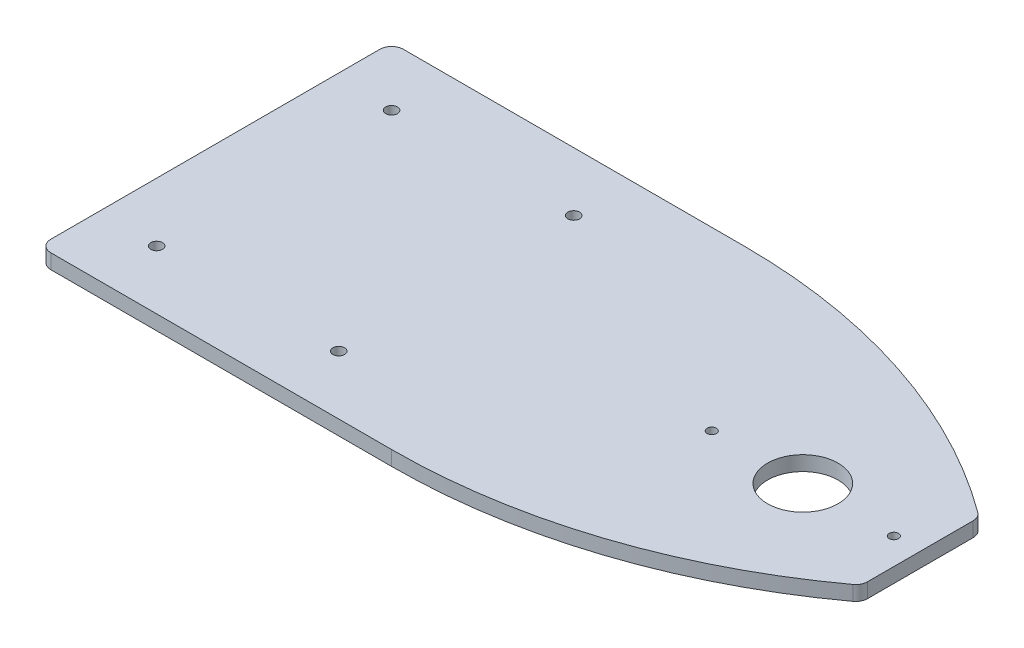
ISO-10303-21;
HEADER;
FILE_DESCRIPTION(('STEP AP214'),'2;1');
FILE_NAME('part.step','',(''),(''),'','','');
FILE_SCHEMA(('AUTOMOTIVE_DESIGN { 1 0 10303 214 1 1 1 1 }'));
ENDSEC;
DATA;
#1=APPLICATION_CONTEXT('core data for automotive mechanical design processes');
#2=APPLICATION_PROTOCOL_DEFINITION('international standard','automotive_design',2000,#1);
#3=PRODUCT_CONTEXT('',#1,'mechanical');
#4=PRODUCT('Part','Part','',(#3));
#5=PRODUCT_RELATED_PRODUCT_CATEGORY('part','',(#4));
#6=PRODUCT_DEFINITION_FORMATION('','',#4);
#7=PRODUCT_DEFINITION_CONTEXT('part definition',#1,'design');
#8=PRODUCT_DEFINITION('design','',#6,#7);
#9=PRODUCT_DEFINITION_SHAPE('','',#8);
#10=(LENGTH_UNIT() NAMED_UNIT(*) SI_UNIT(.MILLI.,.METRE.));
#11=(NAMED_UNIT(*) PLANE_ANGLE_UNIT() SI_UNIT($,.RADIAN.));
#12=(NAMED_UNIT(*) SI_UNIT($,.STERADIAN.) SOLID_ANGLE_UNIT());
#13=UNCERTAINTY_MEASURE_WITH_UNIT(LENGTH_MEASURE(1.E-05),#10,'distance_accuracy_value','');
#14=(GEOMETRIC_REPRESENTATION_CONTEXT(3) GLOBAL_UNCERTAINTY_ASSIGNED_CONTEXT((#13)) GLOBAL_UNIT_ASSIGNED_CONTEXT((#10,
#11,#12)) REPRESENTATION_CONTEXT('',''));
#15=CARTESIAN_POINT('',(0.,0.,0.));
#16=DIRECTION('',(0.,0.,1.));
#17=DIRECTION('',(1.,0.,0.));
#18=AXIS2_PLACEMENT_3D('',#15,#16,#17);
#19=CARTESIAN_POINT('',(76.2,3.175,38.1));
#20=DIRECTION('',(-1.,0.,0.));
#21=DIRECTION('',(0.,0.,1.));
#22=AXIS2_PLACEMENT_3D('',#19,#20,#21);
#23=PLANE('',#22);
#24=DIRECTION('',(0.,0.,-1.));
#25=VECTOR('',#24,1.);
#26=CARTESIAN_POINT('',(76.2,3.175,38.1));
#27=LINE('',#26,#25);
#28=CARTESIAN_POINT('',(76.2,3.175,11.421961703308));
#29=VERTEX_POINT('',#28);
#30=CARTESIAN_POINT('',(76.2,3.175,-11.421961703308));
#31=VERTEX_POINT('',#30);
#32=EDGE_CURVE('E195',#29,#31,#27,.T.);
#33=ORIENTED_EDGE('',*,*,#32,.F.);
#34=DIRECTION('',(0.,1.,0.));
#35=VECTOR('',#34,1.);
#36=CARTESIAN_POINT('',(76.2,3.175,11.421961703308));
#37=LINE('',#36,#35);
#38=CARTESIAN_POINT('',(76.2,0.,11.421961703308));
#39=VERTEX_POINT('',#38);
#40=EDGE_CURVE('E163',#29,#39,#37,.F.);
#41=ORIENTED_EDGE('',*,*,#40,.T.);
#42=DIRECTION('',(0.,0.,-1.));
#43=VECTOR('',#42,1.);
#44=CARTESIAN_POINT('',(76.2,0.,38.1));
#45=LINE('',#44,#43);
#46=CARTESIAN_POINT('',(76.2,0.,-11.421961703308));
#47=VERTEX_POINT('',#46);
#48=EDGE_CURVE('E145',#39,#47,#45,.T.);
#49=ORIENTED_EDGE('',*,*,#48,.T.);
#50=DIRECTION('',(0.,1.,0.));
#51=VECTOR('',#50,1.);
#52=CARTESIAN_POINT('',(76.2,3.175,-11.421961703308));
#53=LINE('',#52,#51);
#54=EDGE_CURVE('E160',#47,#31,#53,.T.);
#55=ORIENTED_EDGE('',*,*,#54,.T.);
#56=EDGE_LOOP('',(#33,#41,#49,#55));
#57=FACE_BOUND('',#56,.T.);
#58=ADVANCED_FACE('F41',(#57),#23,.F.);
#59=CARTESIAN_POINT('',(76.2,3.175,-38.1));
#60=DIRECTION('',(0.,0.,1.));
#61=DIRECTION('',(1.,0.,0.));
#62=AXIS2_PLACEMENT_3D('',#59,#60,#61);
#63=PLANE('',#62);
#64=DIRECTION('',(-1.,0.,0.));
#65=VECTOR('',#64,1.);
#66=CARTESIAN_POINT('',(76.2,0.,-38.1));
#67=LINE('',#66,#65);
#68=CARTESIAN_POINT('',(0.,0.,-38.1));
#69=VERTEX_POINT('',#68);
#70=CARTESIAN_POINT('',(-73.6599999999999,0.,-38.1));
#71=VERTEX_POINT('',#70);
#72=EDGE_CURVE('E134',#69,#71,#67,.T.);
#73=ORIENTED_EDGE('',*,*,#72,.T.);
#74=DIRECTION('',(0.,-1.,0.));
#75=VECTOR('',#74,1.);
#76=CARTESIAN_POINT('',(-73.66,3.175,-38.1));
#77=LINE('',#76,#75);
#78=CARTESIAN_POINT('',(-73.6599999999999,3.175,-38.1));
#79=VERTEX_POINT('',#78);
#80=EDGE_CURVE('E11',#71,#79,#77,.F.);
#81=ORIENTED_EDGE('',*,*,#80,.T.);
#82=DIRECTION('',(-1.,0.,0.));
#83=VECTOR('',#82,1.);
#84=CARTESIAN_POINT('',(76.2,3.175,-38.1));
#85=LINE('',#84,#83);
#86=CARTESIAN_POINT('',(0.,3.175,-38.1));
#87=VERTEX_POINT('',#86);
#88=EDGE_CURVE('E133',#87,#79,#85,.T.);
#89=ORIENTED_EDGE('',*,*,#88,.F.);
#90=DIRECTION('',(0.,1.,0.));
#91=VECTOR('',#90,1.);
#92=CARTESIAN_POINT('',(0.,0.,-38.1));
#93=LINE('',#92,#91);
#94=EDGE_CURVE('E124',#69,#87,#93,.T.);
#95=ORIENTED_EDGE('',*,*,#94,.F.);
#96=EDGE_LOOP('',(#73,#81,#89,#95));
#97=FACE_BOUND('',#96,.T.);
#98=ADVANCED_FACE('F132',(#97),#63,.F.);
#99=CARTESIAN_POINT('',(0.,3.175,0.));
#100=DIRECTION('',(0.,1.,0.));
#101=DIRECTION('',(0.,0.,1.));
#102=AXIS2_PLACEMENT_3D('',#99,#100,#101);
#103=PLANE('',#102);
#104=CARTESIAN_POINT('',(31.115,3.175,0.));
#105=DIRECTION('',(0.,1.,0.));
#106=DIRECTION('',(0.,0.,1.));
#107=AXIS2_PLACEMENT_3D('',#104,#105,#106);
#108=CIRCLE('',#107,1.0033);
#109=CARTESIAN_POINT('',(31.115,3.175,1.0033));
#110=VERTEX_POINT('',#109);
#111=EDGE_CURVE('E246',#110,#110,#108,.T.);
#112=ORIENTED_EDGE('',*,*,#111,.F.);
#113=EDGE_LOOP('',(#112));
#114=FACE_BOUND('',#113,.T.);
#115=CARTESIAN_POINT('',(70.485,3.175,0.));
#116=DIRECTION('',(0.,1.,0.));
#117=DIRECTION('',(0.,0.,1.));
#118=AXIS2_PLACEMENT_3D('',#115,#116,#117);
#119=CIRCLE('',#118,1.0033);
#120=CARTESIAN_POINT('',(70.485,3.175,1.0033));
#121=VERTEX_POINT('',#120);
#122=EDGE_CURVE('E243',#121,#121,#119,.T.);
#123=ORIENTED_EDGE('',*,*,#122,.F.);
#124=EDGE_LOOP('',(#123));
#125=FACE_BOUND('',#124,.T.);
#126=CARTESIAN_POINT('',(-63.5,3.175,25.4));
#127=DIRECTION('',(0.,1.,0.));
#128=DIRECTION('',(0.,0.,1.));
#129=AXIS2_PLACEMENT_3D('',#126,#127,#128);
#130=CIRCLE('',#129,1.27);
#131=CARTESIAN_POINT('',(-63.5,3.175,26.67));
#132=VERTEX_POINT('',#131);
#133=EDGE_CURVE('E218',#132,#132,#130,.T.);
#134=ORIENTED_EDGE('',*,*,#133,.F.);
#135=EDGE_LOOP('',(#134));
#136=FACE_BOUND('',#135,.T.);
#137=CARTESIAN_POINT('',(-24.13,3.175,-25.4));
#138=DIRECTION('',(0.,1.,0.));
#139=DIRECTION('',(0.,0.,1.));
#140=AXIS2_PLACEMENT_3D('',#137,#138,#139);
#141=CIRCLE('',#140,1.27);
#142=CARTESIAN_POINT('',(-24.13,3.175,-24.13));
#143=VERTEX_POINT('',#142);
#144=EDGE_CURVE('E223',#143,#143,#141,.T.);
#145=ORIENTED_EDGE('',*,*,#144,.F.);
#146=EDGE_LOOP('',(#145));
#147=FACE_BOUND('',#146,.T.);
#148=CARTESIAN_POINT('',(-24.13,3.175,25.4));
#149=DIRECTION('',(0.,1.,0.));
#150=DIRECTION('',(0.,0.,1.));
#151=AXIS2_PLACEMENT_3D('',#148,#149,#150);
#152=CIRCLE('',#151,1.27);
#153=CARTESIAN_POINT('',(-24.13,3.175,26.67));
#154=VERTEX_POINT('',#153);
#155=EDGE_CURVE('E228',#154,#154,#152,.T.);
#156=ORIENTED_EDGE('',*,*,#155,.F.);
#157=EDGE_LOOP('',(#156));
#158=FACE_BOUND('',#157,.T.);
#159=CARTESIAN_POINT('',(-63.5,3.175,-25.4));
#160=DIRECTION('',(0.,1.,0.));
#161=DIRECTION('',(0.,0.,1.));
#162=AXIS2_PLACEMENT_3D('',#159,#160,#161);
#163=CIRCLE('',#162,1.27);
#164=CARTESIAN_POINT('',(-63.5,3.175,-24.13));
#165=VERTEX_POINT('',#164);
#166=EDGE_CURVE('E216',#165,#165,#163,.T.);
#167=ORIENTED_EDGE('',*,*,#166,.F.);
#168=EDGE_LOOP('',(#167));
#169=FACE_BOUND('',#168,.T.);
#170=CARTESIAN_POINT('',(50.8,3.175,0.));
#171=DIRECTION('',(0.,1.,0.));
#172=DIRECTION('',(0.,0.,1.));
#173=AXIS2_PLACEMENT_3D('',#170,#171,#172);
#174=CIRCLE('',#173,7.62);
#175=CARTESIAN_POINT('',(50.8,3.175,7.62));
#176=VERTEX_POINT('',#175);
#177=EDGE_CURVE('E208',#176,#176,#174,.T.);
#178=ORIENTED_EDGE('',*,*,#177,.F.);
#179=EDGE_LOOP('',(#178));
#180=FACE_BOUND('',#179,.T.);
#181=DIRECTION('',(0.,0.,1.));
#182=VECTOR('',#181,1.);
#183=CARTESIAN_POINT('',(-76.2,3.175,38.1));
#184=LINE('',#183,#182);
#185=CARTESIAN_POINT('',(-76.2,3.175,-35.56));
#186=VERTEX_POINT('',#185);
#187=CARTESIAN_POINT('',(-76.2,3.175,35.56));
#188=VERTEX_POINT('',#187);
#189=EDGE_CURVE('E142',#186,#188,#184,.T.);
#190=ORIENTED_EDGE('',*,*,#189,.T.);
#191=CARTESIAN_POINT('',(-73.66,3.175,35.56));
#192=DIRECTION('',(0.,1.,0.));
#193=DIRECTION('',(0.,0.,1.));
#194=AXIS2_PLACEMENT_3D('',#191,#192,#193);
#195=CIRCLE('',#194,2.54);
#196=CARTESIAN_POINT('',(-73.6599999999999,3.175,38.1));
#197=VERTEX_POINT('',#196);
#198=EDGE_CURVE('E47',#188,#197,#195,.T.);
#199=ORIENTED_EDGE('',*,*,#198,.T.);
#200=DIRECTION('',(1.,0.,0.));
#201=VECTOR('',#200,1.);
#202=CARTESIAN_POINT('',(76.2,3.175,38.1));
#203=LINE('',#202,#201);
#204=CARTESIAN_POINT('',(0.,3.175,38.1));
#205=VERTEX_POINT('',#204);
#206=EDGE_CURVE('E144',#197,#205,#203,.T.);
#207=ORIENTED_EDGE('',*,*,#206,.T.);
#208=CARTESIAN_POINT('',(0.,3.175,-88.9));
#209=DIRECTION('',(0.,-1.,0.));
#210=DIRECTION('',(0.,0.,1.));
#211=AXIS2_PLACEMENT_3D('',#208,#209,#210);
#212=CIRCLE('',#211,127.);
#213=CARTESIAN_POINT('',(75.1632653061225,3.175,13.4693486768449));
#214=VERTEX_POINT('',#213);
#215=EDGE_CURVE('E203',#214,#205,#212,.T.);
#216=ORIENTED_EDGE('',*,*,#215,.F.);
#217=CARTESIAN_POINT('',(73.66,3.175,11.421961703308));
#218=DIRECTION('',(0.,1.,0.));
#219=DIRECTION('',(0.,0.,1.));
#220=AXIS2_PLACEMENT_3D('',#217,#218,#219);
#221=CIRCLE('',#220,2.54);
#222=EDGE_CURVE('E157',#214,#29,#221,.T.);
#223=ORIENTED_EDGE('',*,*,#222,.T.);
#224=ORIENTED_EDGE('',*,*,#32,.T.);
#225=CARTESIAN_POINT('',(73.66,3.175,-11.421961703308));
#226=DIRECTION('',(0.,1.,0.));
#227=DIRECTION('',(0.,0.,1.));
#228=AXIS2_PLACEMENT_3D('',#225,#226,#227);
#229=CIRCLE('',#228,2.54);
#230=CARTESIAN_POINT('',(75.1632653061225,3.175,-13.469348676845));
#231=VERTEX_POINT('',#230);
#232=EDGE_CURVE('E153',#31,#231,#229,.T.);
#233=ORIENTED_EDGE('',*,*,#232,.T.);
#234=CARTESIAN_POINT('',(0.,3.175,88.9));
#235=DIRECTION('',(0.,-1.,0.));
#236=DIRECTION('',(0.,0.,-1.));
#237=AXIS2_PLACEMENT_3D('',#234,#235,#236);
#238=CIRCLE('',#237,127.);
#239=EDGE_CURVE('E128',#87,#231,#238,.T.);
#240=ORIENTED_EDGE('',*,*,#239,.F.);
#241=ORIENTED_EDGE('',*,*,#88,.T.);
#242=CARTESIAN_POINT('',(-73.66,3.175,-35.56));
#243=DIRECTION('',(0.,1.,0.));
#244=DIRECTION('',(0.,0.,1.));
#245=AXIS2_PLACEMENT_3D('',#242,#243,#244);
#246=CIRCLE('',#245,2.54);
#247=EDGE_CURVE('E178',#79,#186,#246,.T.);
#248=ORIENTED_EDGE('',*,*,#247,.T.);
#249=EDGE_LOOP('',(#190,#199,#207,#216,#223,#224,#233,#240,#241,#248));
#250=FACE_BOUND('',#249,.T.);
#251=ADVANCED_FACE('F185',(#114,#125,#136,#147,#158,#169,#180,#250),#103,.T.);
#252=CARTESIAN_POINT('',(0.,0.,0.));
#253=DIRECTION('',(0.,1.,0.));
#254=DIRECTION('',(0.,0.,1.));
#255=AXIS2_PLACEMENT_3D('',#252,#253,#254);
#256=PLANE('',#255);
#257=CARTESIAN_POINT('',(31.115,0.,0.));
#258=DIRECTION('',(0.,1.,0.));
#259=DIRECTION('',(0.,0.,1.));
#260=AXIS2_PLACEMENT_3D('',#257,#258,#259);
#261=CIRCLE('',#260,1.0033);
#262=CARTESIAN_POINT('',(31.115,0.,1.0033));
#263=VERTEX_POINT('',#262);
#264=EDGE_CURVE('E240',#263,#263,#261,.T.);
#265=ORIENTED_EDGE('',*,*,#264,.T.);
#266=EDGE_LOOP('',(#265));
#267=FACE_BOUND('',#266,.T.);
#268=CARTESIAN_POINT('',(70.485,0.,0.));
#269=DIRECTION('',(0.,1.,0.));
#270=DIRECTION('',(0.,0.,1.));
#271=AXIS2_PLACEMENT_3D('',#268,#269,#270);
#272=CIRCLE('',#271,1.0033);
#273=CARTESIAN_POINT('',(70.485,0.,1.0033));
#274=VERTEX_POINT('',#273);
#275=EDGE_CURVE('E239',#274,#274,#272,.T.);
#276=ORIENTED_EDGE('',*,*,#275,.T.);
#277=EDGE_LOOP('',(#276));
#278=FACE_BOUND('',#277,.T.);
#279=CARTESIAN_POINT('',(-63.5,0.,25.4));
#280=DIRECTION('',(0.,1.,0.));
#281=DIRECTION('',(0.,0.,1.));
#282=AXIS2_PLACEMENT_3D('',#279,#280,#281);
#283=CIRCLE('',#282,1.27);
#284=CARTESIAN_POINT('',(-63.5,0.,26.67));
#285=VERTEX_POINT('',#284);
#286=EDGE_CURVE('E230',#285,#285,#283,.T.);
#287=ORIENTED_EDGE('',*,*,#286,.T.);
#288=EDGE_LOOP('',(#287));
#289=FACE_BOUND('',#288,.T.);
#290=CARTESIAN_POINT('',(-24.13,0.,-25.4));
#291=DIRECTION('',(0.,1.,0.));
#292=DIRECTION('',(0.,0.,1.));
#293=AXIS2_PLACEMENT_3D('',#290,#291,#292);
#294=CIRCLE('',#293,1.27);
#295=CARTESIAN_POINT('',(-24.13,0.,-24.13));
#296=VERTEX_POINT('',#295);
#297=EDGE_CURVE('E224',#296,#296,#294,.T.);
#298=ORIENTED_EDGE('',*,*,#297,.T.);
#299=EDGE_LOOP('',(#298));
#300=FACE_BOUND('',#299,.T.);
#301=CARTESIAN_POINT('',(-24.13,0.,25.4));
#302=DIRECTION('',(0.,1.,0.));
#303=DIRECTION('',(0.,0.,1.));
#304=AXIS2_PLACEMENT_3D('',#301,#302,#303);
#305=CIRCLE('',#304,1.27);
#306=CARTESIAN_POINT('',(-24.13,0.,26.67));
#307=VERTEX_POINT('',#306);
#308=EDGE_CURVE('E234',#307,#307,#305,.T.);
#309=ORIENTED_EDGE('',*,*,#308,.T.);
#310=EDGE_LOOP('',(#309));
#311=FACE_BOUND('',#310,.T.);
#312=CARTESIAN_POINT('',(-63.5,0.,-25.4));
#313=DIRECTION('',(0.,1.,0.));
#314=DIRECTION('',(0.,0.,1.));
#315=AXIS2_PLACEMENT_3D('',#312,#313,#314);
#316=CIRCLE('',#315,1.27);
#317=CARTESIAN_POINT('',(-63.5,0.,-24.13));
#318=VERTEX_POINT('',#317);
#319=EDGE_CURVE('E214',#318,#318,#316,.T.);
#320=ORIENTED_EDGE('',*,*,#319,.T.);
#321=EDGE_LOOP('',(#320));
#322=FACE_BOUND('',#321,.T.);
#323=CARTESIAN_POINT('',(50.8,0.,0.));
#324=DIRECTION('',(0.,1.,0.));
#325=DIRECTION('',(0.,0.,1.));
#326=AXIS2_PLACEMENT_3D('',#323,#324,#325);
#327=CIRCLE('',#326,7.62);
#328=CARTESIAN_POINT('',(50.8,0.,7.62));
#329=VERTEX_POINT('',#328);
#330=EDGE_CURVE('E210',#329,#329,#327,.T.);
#331=ORIENTED_EDGE('',*,*,#330,.T.);
#332=EDGE_LOOP('',(#331));
#333=FACE_BOUND('',#332,.T.);
#334=DIRECTION('',(1.,0.,0.));
#335=VECTOR('',#334,1.);
#336=CARTESIAN_POINT('',(76.2,0.,38.1));
#337=LINE('',#336,#335);
#338=CARTESIAN_POINT('',(-73.6599999999999,0.,38.1));
#339=VERTEX_POINT('',#338);
#340=CARTESIAN_POINT('',(0.,0.,38.0999999999999));
#341=VERTEX_POINT('',#340);
#342=EDGE_CURVE('E150',#339,#341,#337,.T.);
#343=ORIENTED_EDGE('',*,*,#342,.F.);
#344=CARTESIAN_POINT('',(-73.66,0.,35.56));
#345=DIRECTION('',(0.,1.,0.));
#346=DIRECTION('',(0.,0.,1.));
#347=AXIS2_PLACEMENT_3D('',#344,#345,#346);
#348=CIRCLE('',#347,2.54);
#349=CARTESIAN_POINT('',(-76.2,0.,35.56));
#350=VERTEX_POINT('',#349);
#351=EDGE_CURVE('E175',#339,#350,#348,.F.);
#352=ORIENTED_EDGE('',*,*,#351,.T.);
#353=DIRECTION('',(0.,0.,1.));
#354=VECTOR('',#353,1.);
#355=CARTESIAN_POINT('',(-76.2,0.,38.1));
#356=LINE('',#355,#354);
#357=CARTESIAN_POINT('',(-76.2,0.,-35.56));
#358=VERTEX_POINT('',#357);
#359=EDGE_CURVE('E135',#358,#350,#356,.T.);
#360=ORIENTED_EDGE('',*,*,#359,.F.);
#361=CARTESIAN_POINT('',(-73.66,0.,-35.56));
#362=DIRECTION('',(0.,1.,0.));
#363=DIRECTION('',(0.,0.,1.));
#364=AXIS2_PLACEMENT_3D('',#361,#362,#363);
#365=CIRCLE('',#364,2.54);
#366=EDGE_CURVE('E138',#358,#71,#365,.F.);
#367=ORIENTED_EDGE('',*,*,#366,.T.);
#368=ORIENTED_EDGE('',*,*,#72,.F.);
#369=CARTESIAN_POINT('',(0.,0.,88.9));
#370=DIRECTION('',(0.,-1.,0.));
#371=DIRECTION('',(0.,0.,-1.));
#372=AXIS2_PLACEMENT_3D('',#369,#370,#371);
#373=CIRCLE('',#372,127.);
#374=CARTESIAN_POINT('',(75.1632653061225,0.,-13.469348676845));
#375=VERTEX_POINT('',#374);
#376=EDGE_CURVE('E118',#69,#375,#373,.T.);
#377=ORIENTED_EDGE('',*,*,#376,.T.);
#378=CARTESIAN_POINT('',(73.66,0.,-11.421961703308));
#379=DIRECTION('',(0.,1.,0.));
#380=DIRECTION('',(0.,0.,1.));
#381=AXIS2_PLACEMENT_3D('',#378,#379,#380);
#382=CIRCLE('',#381,2.54);
#383=EDGE_CURVE('E161',#375,#47,#382,.F.);
#384=ORIENTED_EDGE('',*,*,#383,.T.);
#385=ORIENTED_EDGE('',*,*,#48,.F.);
#386=CARTESIAN_POINT('',(73.66,0.,11.421961703308));
#387=DIRECTION('',(0.,1.,0.));
#388=DIRECTION('',(0.,0.,1.));
#389=AXIS2_PLACEMENT_3D('',#386,#387,#388);
#390=CIRCLE('',#389,2.54);
#391=CARTESIAN_POINT('',(75.1632653061225,0.,13.4693486768449));
#392=VERTEX_POINT('',#391);
#393=EDGE_CURVE('E164',#39,#392,#390,.F.);
#394=ORIENTED_EDGE('',*,*,#393,.T.);
#395=CARTESIAN_POINT('',(0.,0.,-88.9));
#396=DIRECTION('',(0.,-1.,0.));
#397=DIRECTION('',(0.,0.,1.));
#398=AXIS2_PLACEMENT_3D('',#395,#396,#397);
#399=CIRCLE('',#398,127.);
#400=EDGE_CURVE('E205',#392,#341,#399,.T.);
#401=ORIENTED_EDGE('',*,*,#400,.T.);
#402=EDGE_LOOP('',(#343,#352,#360,#367,#368,#377,#384,#385,#394,#401));
#403=FACE_BOUND('',#402,.T.);
#404=ADVANCED_FACE('F140',(#267,#278,#289,#300,#311,#322,#333,#403),#256,.F.);
#405=CARTESIAN_POINT('',(-76.2,3.175,38.1));
#406=DIRECTION('',(1.,0.,0.));
#407=DIRECTION('',(0.,0.,-1.));
#408=AXIS2_PLACEMENT_3D('',#405,#406,#407);
#409=PLANE('',#408);
#410=ORIENTED_EDGE('',*,*,#359,.T.);
#411=DIRECTION('',(0.,-1.,0.));
#412=VECTOR('',#411,1.);
#413=CARTESIAN_POINT('',(-76.2,3.175,35.56));
#414=LINE('',#413,#412);
#415=EDGE_CURVE('E65',#350,#188,#414,.F.);
#416=ORIENTED_EDGE('',*,*,#415,.T.);
#417=ORIENTED_EDGE('',*,*,#189,.F.);
#418=DIRECTION('',(0.,-1.,0.));
#419=VECTOR('',#418,1.);
#420=CARTESIAN_POINT('',(-76.2,3.175,-35.56));
#421=LINE('',#420,#419);
#422=EDGE_CURVE('E172',#186,#358,#421,.T.);
#423=ORIENTED_EDGE('',*,*,#422,.T.);
#424=EDGE_LOOP('',(#410,#416,#417,#423));
#425=FACE_BOUND('',#424,.T.);
#426=ADVANCED_FACE('F196',(#425),#409,.F.);
#427=CARTESIAN_POINT('',(76.2,3.175,38.1));
#428=DIRECTION('',(0.,0.,-1.));
#429=DIRECTION('',(-1.,0.,0.));
#430=AXIS2_PLACEMENT_3D('',#427,#428,#429);
#431=PLANE('',#430);
#432=ORIENTED_EDGE('',*,*,#206,.F.);
#433=DIRECTION('',(0.,-1.,0.));
#434=VECTOR('',#433,1.);
#435=CARTESIAN_POINT('',(-73.66,3.175,38.1));
#436=LINE('',#435,#434);
#437=EDGE_CURVE('E166',#197,#339,#436,.T.);
#438=ORIENTED_EDGE('',*,*,#437,.T.);
#439=ORIENTED_EDGE('',*,*,#342,.T.);
#440=DIRECTION('',(0.,1.,0.));
#441=VECTOR('',#440,1.);
#442=CARTESIAN_POINT('',(0.,0.,38.1));
#443=LINE('',#442,#441);
#444=EDGE_CURVE('E192',#341,#205,#443,.T.);
#445=ORIENTED_EDGE('',*,*,#444,.T.);
#446=EDGE_LOOP('',(#432,#438,#439,#445));
#447=FACE_BOUND('',#446,.T.);
#448=ADVANCED_FACE('F186',(#447),#431,.F.);
#449=CARTESIAN_POINT('',(0.,0.,-88.9));
#450=DIRECTION('',(0.,1.,0.));
#451=DIRECTION('',(0.,0.,1.));
#452=AXIS2_PLACEMENT_3D('',#449,#450,#451);
#453=CYLINDRICAL_SURFACE('',#452,127.);
#454=ORIENTED_EDGE('',*,*,#400,.F.);
#455=DIRECTION('',(0.,1.,0.));
#456=VECTOR('',#455,1.);
#457=CARTESIAN_POINT('',(75.1632653061225,0.,13.4693486768449));
#458=LINE('',#457,#456);
#459=EDGE_CURVE('E151',#392,#214,#458,.T.);
#460=ORIENTED_EDGE('',*,*,#459,.T.);
#461=ORIENTED_EDGE('',*,*,#215,.T.);
#462=ORIENTED_EDGE('',*,*,#444,.F.);
#463=EDGE_LOOP('',(#454,#460,#461,#462));
#464=FACE_BOUND('',#463,.T.);
#465=ADVANCED_FACE('F302',(#464),#453,.T.);
#466=CARTESIAN_POINT('',(0.,0.,88.9));
#467=DIRECTION('',(0.,1.,0.));
#468=DIRECTION('',(0.,0.,1.));
#469=AXIS2_PLACEMENT_3D('',#466,#467,#468);
#470=CYLINDRICAL_SURFACE('',#469,127.);
#471=ORIENTED_EDGE('',*,*,#239,.T.);
#472=DIRECTION('',(0.,1.,0.));
#473=VECTOR('',#472,1.);
#474=CARTESIAN_POINT('',(75.1632653061225,0.,-13.469348676845));
#475=LINE('',#474,#473);
#476=EDGE_CURVE('E127',#231,#375,#475,.F.);
#477=ORIENTED_EDGE('',*,*,#476,.T.);
#478=ORIENTED_EDGE('',*,*,#376,.F.);
#479=ORIENTED_EDGE('',*,*,#94,.T.);
#480=EDGE_LOOP('',(#471,#477,#478,#479));
#481=FACE_BOUND('',#480,.T.);
#482=ADVANCED_FACE('F125',(#481),#470,.T.);
#483=CARTESIAN_POINT('',(73.66,0.,11.421961703308));
#484=DIRECTION('',(0.,1.,0.));
#485=DIRECTION('',(0.,0.,1.));
#486=AXIS2_PLACEMENT_3D('',#483,#484,#485);
#487=CYLINDRICAL_SURFACE('',#486,2.54);
#488=ORIENTED_EDGE('',*,*,#393,.F.);
#489=ORIENTED_EDGE('',*,*,#40,.F.);
#490=ORIENTED_EDGE('',*,*,#222,.F.);
#491=ORIENTED_EDGE('',*,*,#459,.F.);
#492=EDGE_LOOP('',(#488,#489,#490,#491));
#493=FACE_BOUND('',#492,.T.);
#494=ADVANCED_FACE('F310',(#493),#487,.T.);
#495=CARTESIAN_POINT('',(73.66,0.,-11.421961703308));
#496=DIRECTION('',(0.,1.,0.));
#497=DIRECTION('',(0.,0.,1.));
#498=AXIS2_PLACEMENT_3D('',#495,#496,#497);
#499=CYLINDRICAL_SURFACE('',#498,2.54);
#500=ORIENTED_EDGE('',*,*,#383,.F.);
#501=ORIENTED_EDGE('',*,*,#476,.F.);
#502=ORIENTED_EDGE('',*,*,#232,.F.);
#503=ORIENTED_EDGE('',*,*,#54,.F.);
#504=EDGE_LOOP('',(#500,#501,#502,#503));
#505=FACE_BOUND('',#504,.T.);
#506=ADVANCED_FACE('F309',(#505),#499,.T.);
#507=CARTESIAN_POINT('',(-73.66,3.175,35.56));
#508=DIRECTION('',(0.,-1.,0.));
#509=DIRECTION('',(0.,0.,-1.));
#510=AXIS2_PLACEMENT_3D('',#507,#508,#509);
#511=CYLINDRICAL_SURFACE('',#510,2.54);
#512=ORIENTED_EDGE('',*,*,#198,.F.);
#513=ORIENTED_EDGE('',*,*,#415,.F.);
#514=ORIENTED_EDGE('',*,*,#351,.F.);
#515=ORIENTED_EDGE('',*,*,#437,.F.);
#516=EDGE_LOOP('',(#512,#513,#514,#515));
#517=FACE_BOUND('',#516,.T.);
#518=ADVANCED_FACE('F191',(#517),#511,.T.);
#519=CARTESIAN_POINT('',(-73.66,3.175,-35.56));
#520=DIRECTION('',(0.,-1.,0.));
#521=DIRECTION('',(0.,0.,-1.));
#522=AXIS2_PLACEMENT_3D('',#519,#520,#521);
#523=CYLINDRICAL_SURFACE('',#522,2.54);
#524=ORIENTED_EDGE('',*,*,#247,.F.);
#525=ORIENTED_EDGE('',*,*,#80,.F.);
#526=ORIENTED_EDGE('',*,*,#366,.F.);
#527=ORIENTED_EDGE('',*,*,#422,.F.);
#528=EDGE_LOOP('',(#524,#525,#526,#527));
#529=FACE_BOUND('',#528,.T.);
#530=ADVANCED_FACE('F43',(#529),#523,.T.);
#531=CARTESIAN_POINT('',(50.8,0.,0.));
#532=DIRECTION('',(0.,1.,0.));
#533=DIRECTION('',(0.,0.,1.));
#534=AXIS2_PLACEMENT_3D('',#531,#532,#533);
#535=CYLINDRICAL_SURFACE('',#534,7.62);
#536=ORIENTED_EDGE('',*,*,#330,.F.);
#537=EDGE_LOOP('',(#536));
#538=FACE_BOUND('',#537,.T.);
#539=ORIENTED_EDGE('',*,*,#177,.T.);
#540=EDGE_LOOP('',(#539));
#541=FACE_BOUND('',#540,.T.);
#542=ADVANCED_FACE('F277',(#538,#541),#535,.F.);
#543=CARTESIAN_POINT('',(-63.5,0.,-25.4));
#544=DIRECTION('',(0.,1.,0.));
#545=DIRECTION('',(0.,0.,1.));
#546=AXIS2_PLACEMENT_3D('',#543,#544,#545);
#547=CYLINDRICAL_SURFACE('',#546,1.27);
#548=ORIENTED_EDGE('',*,*,#319,.F.);
#549=EDGE_LOOP('',(#548));
#550=FACE_BOUND('',#549,.T.);
#551=ORIENTED_EDGE('',*,*,#166,.T.);
#552=EDGE_LOOP('',(#551));
#553=FACE_BOUND('',#552,.T.);
#554=ADVANCED_FACE('F279',(#550,#553),#547,.F.);
#555=CARTESIAN_POINT('',(-24.13,0.,25.4));
#556=DIRECTION('',(0.,1.,0.));
#557=DIRECTION('',(0.,0.,1.));
#558=AXIS2_PLACEMENT_3D('',#555,#556,#557);
#559=CYLINDRICAL_SURFACE('',#558,1.27);
#560=ORIENTED_EDGE('',*,*,#308,.F.);
#561=EDGE_LOOP('',(#560));
#562=FACE_BOUND('',#561,.T.);
#563=ORIENTED_EDGE('',*,*,#155,.T.);
#564=EDGE_LOOP('',(#563));
#565=FACE_BOUND('',#564,.T.);
#566=ADVANCED_FACE('F285',(#562,#565),#559,.F.);
#567=CARTESIAN_POINT('',(-24.13,0.,-25.4));
#568=DIRECTION('',(0.,1.,0.));
#569=DIRECTION('',(0.,0.,1.));
#570=AXIS2_PLACEMENT_3D('',#567,#568,#569);
#571=CYLINDRICAL_SURFACE('',#570,1.27);
#572=ORIENTED_EDGE('',*,*,#297,.F.);
#573=EDGE_LOOP('',(#572));
#574=FACE_BOUND('',#573,.T.);
#575=ORIENTED_EDGE('',*,*,#144,.T.);
#576=EDGE_LOOP('',(#575));
#577=FACE_BOUND('',#576,.T.);
#578=ADVANCED_FACE('F343',(#574,#577),#571,.F.);
#579=CARTESIAN_POINT('',(-63.5,0.,25.4));
#580=DIRECTION('',(0.,1.,0.));
#581=DIRECTION('',(0.,0.,1.));
#582=AXIS2_PLACEMENT_3D('',#579,#580,#581);
#583=CYLINDRICAL_SURFACE('',#582,1.27);
#584=ORIENTED_EDGE('',*,*,#286,.F.);
#585=EDGE_LOOP('',(#584));
#586=FACE_BOUND('',#585,.T.);
#587=ORIENTED_EDGE('',*,*,#133,.T.);
#588=EDGE_LOOP('',(#587));
#589=FACE_BOUND('',#588,.T.);
#590=ADVANCED_FACE('F353',(#586,#589),#583,.F.);
#591=CARTESIAN_POINT('',(70.485,0.,0.));
#592=DIRECTION('',(0.,1.,0.));
#593=DIRECTION('',(0.,0.,1.));
#594=AXIS2_PLACEMENT_3D('',#591,#592,#593);
#595=CYLINDRICAL_SURFACE('',#594,1.0033);
#596=ORIENTED_EDGE('',*,*,#275,.F.);
#597=EDGE_LOOP('',(#596));
#598=FACE_BOUND('',#597,.T.);
#599=ORIENTED_EDGE('',*,*,#122,.T.);
#600=EDGE_LOOP('',(#599));
#601=FACE_BOUND('',#600,.T.);
#602=ADVANCED_FACE('F260',(#598,#601),#595,.F.);
#603=CARTESIAN_POINT('',(31.115,0.,0.));
#604=DIRECTION('',(0.,1.,0.));
#605=DIRECTION('',(0.,0.,1.));
#606=AXIS2_PLACEMENT_3D('',#603,#604,#605);
#607=CYLINDRICAL_SURFACE('',#606,1.0033);
#608=ORIENTED_EDGE('',*,*,#264,.F.);
#609=EDGE_LOOP('',(#608));
#610=FACE_BOUND('',#609,.T.);
#611=ORIENTED_EDGE('',*,*,#111,.T.);
#612=EDGE_LOOP('',(#611));
#613=FACE_BOUND('',#612,.T.);
#614=ADVANCED_FACE('F251',(#610,#613),#607,.F.);
#615=CLOSED_SHELL('',(#58,#98,#251,#404,#426,#448,#465,#482,#494,#506,#518,#530,#542,#554,#566,
#578,#590,#602,#614));
#616=MANIFOLD_SOLID_BREP('B2',#615);
#617=ADVANCED_BREP_SHAPE_REPRESENTATION('',(#18,#616),#14);
#618=SHAPE_DEFINITION_REPRESENTATION(#9,#617);
ENDSEC;
END-ISO-10303-21;
